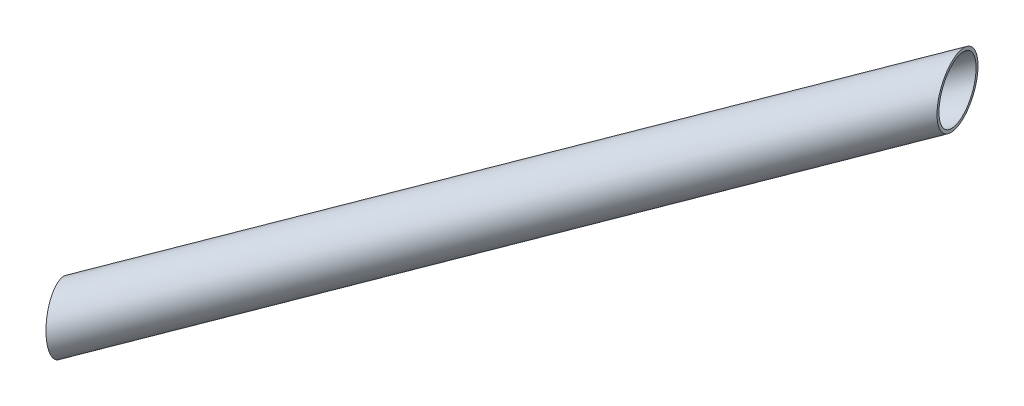
ISO-10303-21;
HEADER;
FILE_DESCRIPTION(('STEP AP214'),'2;1');
FILE_NAME('part.step','',(''),(''),'','','');
FILE_SCHEMA(('AUTOMOTIVE_DESIGN { 1 0 10303 214 1 1 1 1 }'));
ENDSEC;
DATA;
#1=APPLICATION_CONTEXT('core data for automotive mechanical design processes');
#2=APPLICATION_PROTOCOL_DEFINITION('international standard','automotive_design',2000,#1);
#3=PRODUCT_CONTEXT('',#1,'mechanical');
#4=PRODUCT('Part','Part','',(#3));
#5=PRODUCT_RELATED_PRODUCT_CATEGORY('part','',(#4));
#6=PRODUCT_DEFINITION_FORMATION('','',#4);
#7=PRODUCT_DEFINITION_CONTEXT('part definition',#1,'design');
#8=PRODUCT_DEFINITION('design','',#6,#7);
#9=PRODUCT_DEFINITION_SHAPE('','',#8);
#10=(LENGTH_UNIT() NAMED_UNIT(*) SI_UNIT(.MILLI.,.METRE.));
#11=(NAMED_UNIT(*) PLANE_ANGLE_UNIT() SI_UNIT($,.RADIAN.));
#12=(NAMED_UNIT(*) SI_UNIT($,.STERADIAN.) SOLID_ANGLE_UNIT());
#13=UNCERTAINTY_MEASURE_WITH_UNIT(LENGTH_MEASURE(1.E-05),#10,'distance_accuracy_value','');
#14=(GEOMETRIC_REPRESENTATION_CONTEXT(3) GLOBAL_UNCERTAINTY_ASSIGNED_CONTEXT((#13)) GLOBAL_UNIT_ASSIGNED_CONTEXT((#10,
#11,#12)) REPRESENTATION_CONTEXT('',''));
#15=CARTESIAN_POINT('',(0.,0.,0.));
#16=DIRECTION('',(0.,0.,1.));
#17=DIRECTION('',(1.,0.,0.));
#18=AXIS2_PLACEMENT_3D('',#15,#16,#17);
#19=CARTESIAN_POINT('',(50.,129.999999999998,-6.93889390390723E-13));
#20=DIRECTION('',(0.636784790371593,0.25471391614865,-0.727754046138958));
#21=DIRECTION('',(-0.752576694706875,0.,-0.658504607868521));
#22=AXIS2_PLACEMENT_3D('',#19,#20,#21);
#23=CYLINDRICAL_SURFACE('',#22,11.3);
#24=CARTESIAN_POINT('',(234.387283977394,203.75491359096,-210.728324545593));
#25=DIRECTION('',(0.946820221432302,0.0572844625639539,-0.316622738658557));
#26=DIRECTION('',(-0.313257210262409,0.388871019636101,-0.866400167535644));
#27=AXIS2_PLACEMENT_3D('',#24,#25,#26);
#28=ELLIPSE('',#27,13.3264877614498,11.3);
#29=CARTESIAN_POINT('',(230.212665598647,208.937198474923,-222.274395774774));
#30=VERTEX_POINT('',#29);
#31=EDGE_CURVE('E53',#30,#30,#28,.T.);
#32=ORIENTED_EDGE('',*,*,#31,.T.);
#33=EDGE_LOOP('',(#32));
#34=FACE_BOUND('',#33,.T.);
#35=CARTESIAN_POINT('',(50.,129.999999999998,-6.38378239159465E-13));
#36=DIRECTION('',(-0.904650427063292,-0.140780299510563,0.402229427172999));
#37=DIRECTION('',(-0.426154437750217,0.298851652810827,-0.853861865173773));
#38=AXIS2_PLACEMENT_3D('',#35,#36,#37);
#39=ELLIPSE('',#38,12.4910127292842,11.3);
#40=CARTESIAN_POINT('',(44.676899493421,133.732959799426,-10.6655994269366));
#41=VERTEX_POINT('',#40);
#42=EDGE_CURVE('E43',#41,#41,#39,.T.);
#43=ORIENTED_EDGE('',*,*,#42,.T.);
#44=EDGE_LOOP('',(#43));
#45=FACE_BOUND('',#44,.T.);
#46=ADVANCED_FACE('F39',(#34,#45),#23,.F.);
#47=CARTESIAN_POINT('',(50.,129.999999999998,-6.93889390390723E-13));
#48=DIRECTION('',(0.636784790371593,0.25471391614865,-0.727754046138958));
#49=DIRECTION('',(-0.752576694706875,0.,-0.658504607868521));
#50=AXIS2_PLACEMENT_3D('',#47,#48,#49);
#51=CYLINDRICAL_SURFACE('',#50,12.5);
#52=CARTESIAN_POINT('',(234.387283977394,203.75491359096,-210.728324545593));
#53=DIRECTION('',(0.946820221432302,0.0572844625639539,-0.316622738658557));
#54=DIRECTION('',(-0.313257210262409,0.388871019636101,-0.866400167535644));
#55=AXIS2_PLACEMENT_3D('',#52,#53,#54);
#56=ELLIPSE('',#55,14.7416900016037,12.5);
#57=CARTESIAN_POINT('',(229.769343292939,209.487529613043,-223.500527232741));
#58=VERTEX_POINT('',#57);
#59=EDGE_CURVE('E47',#58,#58,#56,.T.);
#60=ORIENTED_EDGE('',*,*,#59,.F.);
#61=EDGE_LOOP('',(#60));
#62=FACE_BOUND('',#61,.T.);
#63=CARTESIAN_POINT('',(50.,129.999999999998,-6.38378239159465E-13));
#64=DIRECTION('',(-0.904650427063292,-0.140780299510563,0.402229427172999));
#65=DIRECTION('',(-0.426154437750217,0.298851652810827,-0.853861865173773));
#66=AXIS2_PLACEMENT_3D('',#63,#64,#65);
#67=ELLIPSE('',#66,13.8174919571728,12.5);
#68=CARTESIAN_POINT('',(44.1116144838728,134.1293803091,-11.7982294545758));
#69=VERTEX_POINT('',#68);
#70=EDGE_CURVE('E10',#69,#69,#67,.T.);
#71=ORIENTED_EDGE('',*,*,#70,.F.);
#72=EDGE_LOOP('',(#71));
#73=FACE_BOUND('',#72,.T.);
#74=ADVANCED_FACE('F66',(#62,#73),#51,.T.);
#75=CARTESIAN_POINT('',(237.753929508648,212.209925210713,-199.131087785049));
#76=DIRECTION('',(0.946820221432302,0.0572844625639539,-0.316622738658557));
#77=DIRECTION('',(-0.317143521010221,0.,-0.948377555133629));
#78=AXIS2_PLACEMENT_3D('',#75,#76,#77);
#79=PLANE('',#78);
#80=ORIENTED_EDGE('',*,*,#31,.F.);
#81=EDGE_LOOP('',(#80));
#82=FACE_BOUND('',#81,.T.);
#83=ORIENTED_EDGE('',*,*,#59,.T.);
#84=EDGE_LOOP('',(#83));
#85=FACE_BOUND('',#84,.T.);
#86=ADVANCED_FACE('F62',(#82,#85),#79,.T.);
#87=CARTESIAN_POINT('',(49.9999999999999,129.999999999998,-7.21644966006352E-13));
#88=DIRECTION('',(-0.904650427063292,-0.140780299510563,0.402229427172999));
#89=DIRECTION('',(0.406275581998158,0.,0.913750595880549));
#90=AXIS2_PLACEMENT_3D('',#87,#88,#89);
#91=PLANE('',#90);
#92=ORIENTED_EDGE('',*,*,#42,.F.);
#93=EDGE_LOOP('',(#92));
#94=FACE_BOUND('',#93,.T.);
#95=ORIENTED_EDGE('',*,*,#70,.T.);
#96=EDGE_LOOP('',(#95));
#97=FACE_BOUND('',#96,.T.);
#98=ADVANCED_FACE('F41',(#94,#97),#91,.T.);
#99=CLOSED_SHELL('',(#46,#74,#86,#98));
#100=MANIFOLD_SOLID_BREP('B2',#99);
#101=ADVANCED_BREP_SHAPE_REPRESENTATION('',(#18,#100),#14);
#102=SHAPE_DEFINITION_REPRESENTATION(#9,#101);
ENDSEC;
END-ISO-10303-21;
